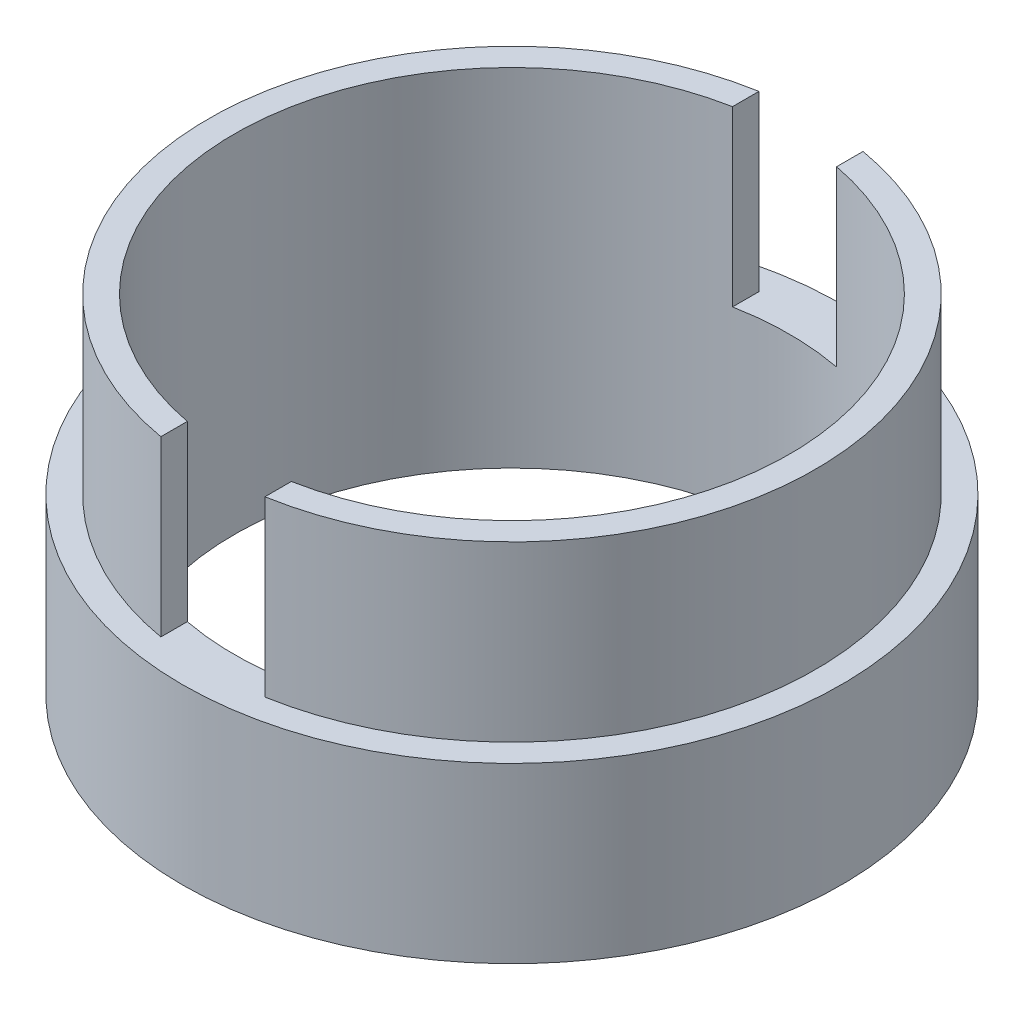
ISO-10303-21;
HEADER;
FILE_DESCRIPTION(('STEP AP214'),'2;1');
FILE_NAME('part.step','',(''),(''),'','','');
FILE_SCHEMA(('AUTOMOTIVE_DESIGN { 1 0 10303 214 1 1 1 1 }'));
ENDSEC;
DATA;
#1=APPLICATION_CONTEXT('core data for automotive mechanical design processes');
#2=APPLICATION_PROTOCOL_DEFINITION('international standard','automotive_design',2000,#1);
#3=PRODUCT_CONTEXT('',#1,'mechanical');
#4=PRODUCT('Part','Part','',(#3));
#5=PRODUCT_RELATED_PRODUCT_CATEGORY('part','',(#4));
#6=PRODUCT_DEFINITION_FORMATION('','',#4);
#7=PRODUCT_DEFINITION_CONTEXT('part definition',#1,'design');
#8=PRODUCT_DEFINITION('design','',#6,#7);
#9=PRODUCT_DEFINITION_SHAPE('','',#8);
#10=(LENGTH_UNIT() NAMED_UNIT(*) SI_UNIT(.MILLI.,.METRE.));
#11=(NAMED_UNIT(*) PLANE_ANGLE_UNIT() SI_UNIT($,.RADIAN.));
#12=(NAMED_UNIT(*) SI_UNIT($,.STERADIAN.) SOLID_ANGLE_UNIT());
#13=UNCERTAINTY_MEASURE_WITH_UNIT(LENGTH_MEASURE(1.E-05),#10,'distance_accuracy_value','');
#14=(GEOMETRIC_REPRESENTATION_CONTEXT(3) GLOBAL_UNCERTAINTY_ASSIGNED_CONTEXT((#13)) GLOBAL_UNIT_ASSIGNED_CONTEXT((#10,
#11,#12)) REPRESENTATION_CONTEXT('',''));
#15=CARTESIAN_POINT('',(0.,0.,0.));
#16=DIRECTION('',(0.,0.,1.));
#17=DIRECTION('',(1.,0.,0.));
#18=AXIS2_PLACEMENT_3D('',#15,#16,#17);
#19=CARTESIAN_POINT('',(0.,45.892381107845,0.));
#20=DIRECTION('',(0.,1.,0.));
#21=DIRECTION('',(0.,0.,1.));
#22=AXIS2_PLACEMENT_3D('',#19,#20,#21);
#23=PLANE('',#22);
#24=DIRECTION('',(0.,0.,1.));
#25=VECTOR('',#24,1.);
#26=CARTESIAN_POINT('',(1.5,45.892381107845,-9.49999999999999));
#27=LINE('',#26,#25);
#28=CARTESIAN_POINT('',(1.5,45.892381107845,7.85811682275087));
#29=VERTEX_POINT('',#28);
#30=CARTESIAN_POINT('',(1.5,45.892381107845,8.62046982478334));
#31=VERTEX_POINT('',#30);
#32=EDGE_CURVE('E166',#29,#31,#27,.T.);
#33=ORIENTED_EDGE('',*,*,#32,.T.);
#34=CARTESIAN_POINT('',(0.,45.892381107845,0.));
#35=DIRECTION('',(0.,1.,0.));
#36=DIRECTION('',(0.,0.,1.));
#37=AXIS2_PLACEMENT_3D('',#34,#35,#36);
#38=CIRCLE('',#37,8.75);
#39=CARTESIAN_POINT('',(1.5,45.892381107845,-8.62046982478332));
#40=VERTEX_POINT('',#39);
#41=EDGE_CURVE('E125',#31,#40,#38,.T.);
#42=ORIENTED_EDGE('',*,*,#41,.T.);
#43=CARTESIAN_POINT('',(1.5,45.892381107845,-7.85811682275085));
#44=VERTEX_POINT('',#43);
#45=EDGE_CURVE('E164',#40,#44,#27,.T.);
#46=ORIENTED_EDGE('',*,*,#45,.T.);
#47=CARTESIAN_POINT('',(0.,45.892381107845,0.));
#48=DIRECTION('',(0.,1.,0.));
#49=DIRECTION('',(0.,0.,1.));
#50=AXIS2_PLACEMENT_3D('',#47,#48,#49);
#51=CIRCLE('',#50,8.);
#52=EDGE_CURVE('E136',#29,#44,#51,.T.);
#53=ORIENTED_EDGE('',*,*,#52,.F.);
#54=EDGE_LOOP('',(#33,#42,#46,#53));
#55=FACE_BOUND('',#54,.T.);
#56=ADVANCED_FACE('F38',(#55),#23,.T.);
#57=CARTESIAN_POINT('',(0.,45.892381107845,0.));
#58=DIRECTION('',(0.,-1.,0.));
#59=DIRECTION('',(0.,0.,-1.));
#60=AXIS2_PLACEMENT_3D('',#57,#58,#59);
#61=CYLINDRICAL_SURFACE('',#60,8.75);
#62=ORIENTED_EDGE('',*,*,#41,.F.);
#63=DIRECTION('',(0.,-1.,0.));
#64=VECTOR('',#63,1.);
#65=CARTESIAN_POINT('',(1.5,45.892381107845,8.62046982478334));
#66=LINE('',#65,#64);
#67=CARTESIAN_POINT('',(1.5,40.892381107845,8.62046982478334));
#68=VERTEX_POINT('',#67);
#69=EDGE_CURVE('E11',#31,#68,#66,.T.);
#70=ORIENTED_EDGE('',*,*,#69,.T.);
#71=CARTESIAN_POINT('',(0.,40.892381107845,0.));
#72=DIRECTION('',(0.,1.,0.));
#73=DIRECTION('',(0.,0.,1.));
#74=AXIS2_PLACEMENT_3D('',#71,#72,#73);
#75=CIRCLE('',#74,8.75);
#76=CARTESIAN_POINT('',(1.5,40.892381107845,-8.62046982478332));
#77=VERTEX_POINT('',#76);
#78=EDGE_CURVE('E126',#68,#77,#75,.T.);
#79=ORIENTED_EDGE('',*,*,#78,.T.);
#80=DIRECTION('',(0.,-1.,0.));
#81=VECTOR('',#80,1.);
#82=CARTESIAN_POINT('',(1.5,45.892381107845,-8.62046982478332));
#83=LINE('',#82,#81);
#84=EDGE_CURVE('E47',#77,#40,#83,.F.);
#85=ORIENTED_EDGE('',*,*,#84,.T.);
#86=EDGE_LOOP('',(#62,#70,#79,#85));
#87=FACE_BOUND('',#86,.T.);
#88=ADVANCED_FACE('F155',(#87),#61,.T.);
#89=CARTESIAN_POINT('',(0.,40.892381107845,0.));
#90=DIRECTION('',(0.,1.,0.));
#91=DIRECTION('',(0.,0.,1.));
#92=AXIS2_PLACEMENT_3D('',#89,#90,#91);
#93=PLANE('',#92);
#94=ORIENTED_EDGE('',*,*,#78,.F.);
#95=DIRECTION('',(0.,0.,1.));
#96=VECTOR('',#95,1.);
#97=CARTESIAN_POINT('',(1.5,40.892381107845,-9.49999999999999));
#98=LINE('',#97,#96);
#99=CARTESIAN_POINT('',(1.5,40.892381107845,7.85811682275087));
#100=VERTEX_POINT('',#99);
#101=EDGE_CURVE('E175',#100,#68,#98,.T.);
#102=ORIENTED_EDGE('',*,*,#101,.F.);
#103=CARTESIAN_POINT('',(0.,40.892381107845,0.));
#104=DIRECTION('',(0.,-1.,0.));
#105=DIRECTION('',(0.,0.,-1.));
#106=AXIS2_PLACEMENT_3D('',#103,#104,#105);
#107=CIRCLE('',#106,8.);
#108=CARTESIAN_POINT('',(-1.5,40.892381107845,7.85811682275087));
#109=VERTEX_POINT('',#108);
#110=EDGE_CURVE('E191',#100,#109,#107,.T.);
#111=ORIENTED_EDGE('',*,*,#110,.T.);
#112=DIRECTION('',(0.,0.,1.));
#113=VECTOR('',#112,1.);
#114=CARTESIAN_POINT('',(-1.5,40.892381107845,-9.49999999999999));
#115=LINE('',#114,#113);
#116=CARTESIAN_POINT('',(-1.5,40.892381107845,8.62046982478335));
#117=VERTEX_POINT('',#116);
#118=EDGE_CURVE('E121',#109,#117,#115,.T.);
#119=ORIENTED_EDGE('',*,*,#118,.T.);
#120=CARTESIAN_POINT('',(-1.5,40.892381107845,-8.62046982478332));
#121=VERTEX_POINT('',#120);
#122=EDGE_CURVE('E133',#121,#117,#75,.T.);
#123=ORIENTED_EDGE('',*,*,#122,.F.);
#124=CARTESIAN_POINT('',(-1.5,40.892381107845,-7.85811682275085));
#125=VERTEX_POINT('',#124);
#126=EDGE_CURVE('E54',#121,#125,#115,.T.);
#127=ORIENTED_EDGE('',*,*,#126,.T.);
#128=CARTESIAN_POINT('',(1.5,40.892381107845,-7.85811682275085));
#129=VERTEX_POINT('',#128);
#130=EDGE_CURVE('E188',#125,#129,#107,.T.);
#131=ORIENTED_EDGE('',*,*,#130,.T.);
#132=EDGE_CURVE('E170',#77,#129,#98,.T.);
#133=ORIENTED_EDGE('',*,*,#132,.F.);
#134=EDGE_LOOP('',(#94,#102,#111,#119,#123,#127,#131,#133));
#135=FACE_BOUND('',#134,.T.);
#136=CARTESIAN_POINT('',(0.,40.892381107845,0.));
#137=DIRECTION('',(0.,1.,0.));
#138=DIRECTION('',(0.,0.,1.));
#139=AXIS2_PLACEMENT_3D('',#136,#137,#138);
#140=CIRCLE('',#139,9.5);
#141=CARTESIAN_POINT('',(0.,40.892381107845,9.50000000000001));
#142=VERTEX_POINT('',#141);
#143=EDGE_CURVE('E143',#142,#142,#140,.T.);
#144=ORIENTED_EDGE('',*,*,#143,.T.);
#145=EDGE_LOOP('',(#144));
#146=FACE_BOUND('',#145,.T.);
#147=ADVANCED_FACE('F204',(#135,#146),#93,.T.);
#148=CARTESIAN_POINT('',(0.,35.892381107845,0.));
#149=DIRECTION('',(0.,1.,0.));
#150=DIRECTION('',(0.,0.,1.));
#151=AXIS2_PLACEMENT_3D('',#148,#149,#150);
#152=PLANE('',#151);
#153=CARTESIAN_POINT('',(0.,35.892381107845,0.));
#154=DIRECTION('',(0.,1.,0.));
#155=DIRECTION('',(0.,0.,1.));
#156=AXIS2_PLACEMENT_3D('',#153,#154,#155);
#157=CIRCLE('',#156,9.5);
#158=CARTESIAN_POINT('',(0.,35.892381107845,9.50000000000001));
#159=VERTEX_POINT('',#158);
#160=EDGE_CURVE('E142',#159,#159,#157,.T.);
#161=ORIENTED_EDGE('',*,*,#160,.F.);
#162=EDGE_LOOP('',(#161));
#163=FACE_BOUND('',#162,.T.);
#164=CARTESIAN_POINT('',(0.,35.892381107845,0.));
#165=DIRECTION('',(0.,1.,0.));
#166=DIRECTION('',(0.,0.,1.));
#167=AXIS2_PLACEMENT_3D('',#164,#165,#166);
#168=CIRCLE('',#167,8.);
#169=CARTESIAN_POINT('',(0.,35.892381107845,8.00000000000001));
#170=VERTEX_POINT('',#169);
#171=EDGE_CURVE('E131',#170,#170,#168,.T.);
#172=ORIENTED_EDGE('',*,*,#171,.T.);
#173=EDGE_LOOP('',(#172));
#174=FACE_BOUND('',#173,.T.);
#175=ADVANCED_FACE('F217',(#163,#174),#152,.F.);
#176=CARTESIAN_POINT('',(0.,40.892381107845,0.));
#177=DIRECTION('',(0.,-1.,0.));
#178=DIRECTION('',(0.,0.,-1.));
#179=AXIS2_PLACEMENT_3D('',#176,#177,#178);
#180=CYLINDRICAL_SURFACE('',#179,9.5);
#181=ORIENTED_EDGE('',*,*,#143,.F.);
#182=EDGE_LOOP('',(#181));
#183=FACE_BOUND('',#182,.T.);
#184=ORIENTED_EDGE('',*,*,#160,.T.);
#185=EDGE_LOOP('',(#184));
#186=FACE_BOUND('',#185,.T.);
#187=ADVANCED_FACE('F40',(#183,#186),#180,.T.);
#188=CARTESIAN_POINT('',(0.,40.892381107845,0.));
#189=DIRECTION('',(0.,-1.,0.));
#190=DIRECTION('',(0.,0.,-1.));
#191=AXIS2_PLACEMENT_3D('',#188,#189,#190);
#192=CYLINDRICAL_SURFACE('',#191,8.);
#193=DIRECTION('',(0.,-1.,0.));
#194=VECTOR('',#193,1.);
#195=CARTESIAN_POINT('',(1.5,40.892381107845,-7.85811682275085));
#196=LINE('',#195,#194);
#197=EDGE_CURVE('E192',#129,#44,#196,.F.);
#198=ORIENTED_EDGE('',*,*,#197,.F.);
#199=ORIENTED_EDGE('',*,*,#130,.F.);
#200=DIRECTION('',(0.,-1.,0.));
#201=VECTOR('',#200,1.);
#202=CARTESIAN_POINT('',(-1.5,40.892381107845,-7.85811682275085));
#203=LINE('',#202,#201);
#204=CARTESIAN_POINT('',(-1.5,45.892381107845,-7.85811682275085));
#205=VERTEX_POINT('',#204);
#206=EDGE_CURVE('E185',#205,#125,#203,.T.);
#207=ORIENTED_EDGE('',*,*,#206,.F.);
#208=CARTESIAN_POINT('',(-1.5,45.892381107845,7.85811682275087));
#209=VERTEX_POINT('',#208);
#210=EDGE_CURVE('E119',#205,#209,#51,.T.);
#211=ORIENTED_EDGE('',*,*,#210,.T.);
#212=DIRECTION('',(0.,-1.,0.));
#213=VECTOR('',#212,1.);
#214=CARTESIAN_POINT('',(-1.5,40.892381107845,7.85811682275087));
#215=LINE('',#214,#213);
#216=EDGE_CURVE('E174',#109,#209,#215,.F.);
#217=ORIENTED_EDGE('',*,*,#216,.F.);
#218=ORIENTED_EDGE('',*,*,#110,.F.);
#219=DIRECTION('',(0.,-1.,0.));
#220=VECTOR('',#219,1.);
#221=CARTESIAN_POINT('',(1.5,40.892381107845,7.85811682275087));
#222=LINE('',#221,#220);
#223=EDGE_CURVE('E194',#29,#100,#222,.T.);
#224=ORIENTED_EDGE('',*,*,#223,.F.);
#225=ORIENTED_EDGE('',*,*,#52,.T.);
#226=EDGE_LOOP('',(#198,#199,#207,#211,#217,#218,#224,#225));
#227=FACE_BOUND('',#226,.T.);
#228=ORIENTED_EDGE('',*,*,#171,.F.);
#229=EDGE_LOOP('',(#228));
#230=FACE_BOUND('',#229,.T.);
#231=ADVANCED_FACE('F210',(#227,#230),#192,.F.);
#232=DIRECTION('',(0.,0.,1.));
#233=VECTOR('',#232,1.);
#234=CARTESIAN_POINT('',(-1.5,45.892381107845,-9.49999999999999));
#235=LINE('',#234,#233);
#236=CARTESIAN_POINT('',(-1.5,45.892381107845,-8.62046982478332));
#237=VERTEX_POINT('',#236);
#238=EDGE_CURVE('E104',#237,#205,#235,.T.);
#239=ORIENTED_EDGE('',*,*,#238,.F.);
#240=CARTESIAN_POINT('',(-1.5,45.892381107845,8.62046982478334));
#241=VERTEX_POINT('',#240);
#242=EDGE_CURVE('E117',#237,#241,#38,.T.);
#243=ORIENTED_EDGE('',*,*,#242,.T.);
#244=EDGE_CURVE('E62',#209,#241,#235,.T.);
#245=ORIENTED_EDGE('',*,*,#244,.F.);
#246=ORIENTED_EDGE('',*,*,#210,.F.);
#247=EDGE_LOOP('',(#239,#243,#245,#246));
#248=FACE_BOUND('',#247,.T.);
#249=ADVANCED_FACE('F116',(#248),#23,.T.);
#250=ORIENTED_EDGE('',*,*,#242,.F.);
#251=DIRECTION('',(0.,-1.,0.));
#252=VECTOR('',#251,1.);
#253=CARTESIAN_POINT('',(-1.5,45.892381107845,-8.62046982478332));
#254=LINE('',#253,#252);
#255=EDGE_CURVE('E101',#237,#121,#254,.T.);
#256=ORIENTED_EDGE('',*,*,#255,.T.);
#257=ORIENTED_EDGE('',*,*,#122,.T.);
#258=DIRECTION('',(0.,-1.,0.));
#259=VECTOR('',#258,1.);
#260=CARTESIAN_POINT('',(-1.5,45.892381107845,8.62046982478334));
#261=LINE('',#260,#259);
#262=EDGE_CURVE('E111',#117,#241,#261,.F.);
#263=ORIENTED_EDGE('',*,*,#262,.T.);
#264=EDGE_LOOP('',(#250,#256,#257,#263));
#265=FACE_BOUND('',#264,.T.);
#266=ADVANCED_FACE('F123',(#265),#61,.T.);
#267=CARTESIAN_POINT('',(-1.5,45.892381107845,-9.49999999999999));
#268=DIRECTION('',(-1.,0.,0.));
#269=DIRECTION('',(0.,-1.,0.));
#270=AXIS2_PLACEMENT_3D('',#267,#268,#269);
#271=PLANE('',#270);
#272=ORIENTED_EDGE('',*,*,#216,.T.);
#273=ORIENTED_EDGE('',*,*,#244,.T.);
#274=ORIENTED_EDGE('',*,*,#262,.F.);
#275=ORIENTED_EDGE('',*,*,#118,.F.);
#276=EDGE_LOOP('',(#272,#273,#274,#275));
#277=FACE_BOUND('',#276,.T.);
#278=ADVANCED_FACE('F209',(#277),#271,.F.);
#279=CARTESIAN_POINT('',(1.5,45.892381107845,-9.49999999999999));
#280=DIRECTION('',(1.,0.,0.));
#281=DIRECTION('',(0.,1.,0.));
#282=AXIS2_PLACEMENT_3D('',#279,#280,#281);
#283=PLANE('',#282);
#284=ORIENTED_EDGE('',*,*,#223,.T.);
#285=ORIENTED_EDGE('',*,*,#101,.T.);
#286=ORIENTED_EDGE('',*,*,#69,.F.);
#287=ORIENTED_EDGE('',*,*,#32,.F.);
#288=EDGE_LOOP('',(#284,#285,#286,#287));
#289=FACE_BOUND('',#288,.T.);
#290=ADVANCED_FACE('F241',(#289),#283,.F.);
#291=ORIENTED_EDGE('',*,*,#197,.T.);
#292=ORIENTED_EDGE('',*,*,#45,.F.);
#293=ORIENTED_EDGE('',*,*,#84,.F.);
#294=ORIENTED_EDGE('',*,*,#132,.T.);
#295=EDGE_LOOP('',(#291,#292,#293,#294));
#296=FACE_BOUND('',#295,.T.);
#297=ADVANCED_FACE('F245',(#296),#283,.F.);
#298=ORIENTED_EDGE('',*,*,#206,.T.);
#299=ORIENTED_EDGE('',*,*,#126,.F.);
#300=ORIENTED_EDGE('',*,*,#255,.F.);
#301=ORIENTED_EDGE('',*,*,#238,.T.);
#302=EDGE_LOOP('',(#298,#299,#300,#301));
#303=FACE_BOUND('',#302,.T.);
#304=ADVANCED_FACE('F103',(#303),#271,.F.);
#305=CLOSED_SHELL('',(#56,#88,#147,#175,#187,#231,#249,#266,#278,#290,#297,#304));
#306=MANIFOLD_SOLID_BREP('B2',#305);
#307=ADVANCED_BREP_SHAPE_REPRESENTATION('',(#18,#306),#14);
#308=SHAPE_DEFINITION_REPRESENTATION(#9,#307);
ENDSEC;
END-ISO-10303-21;
